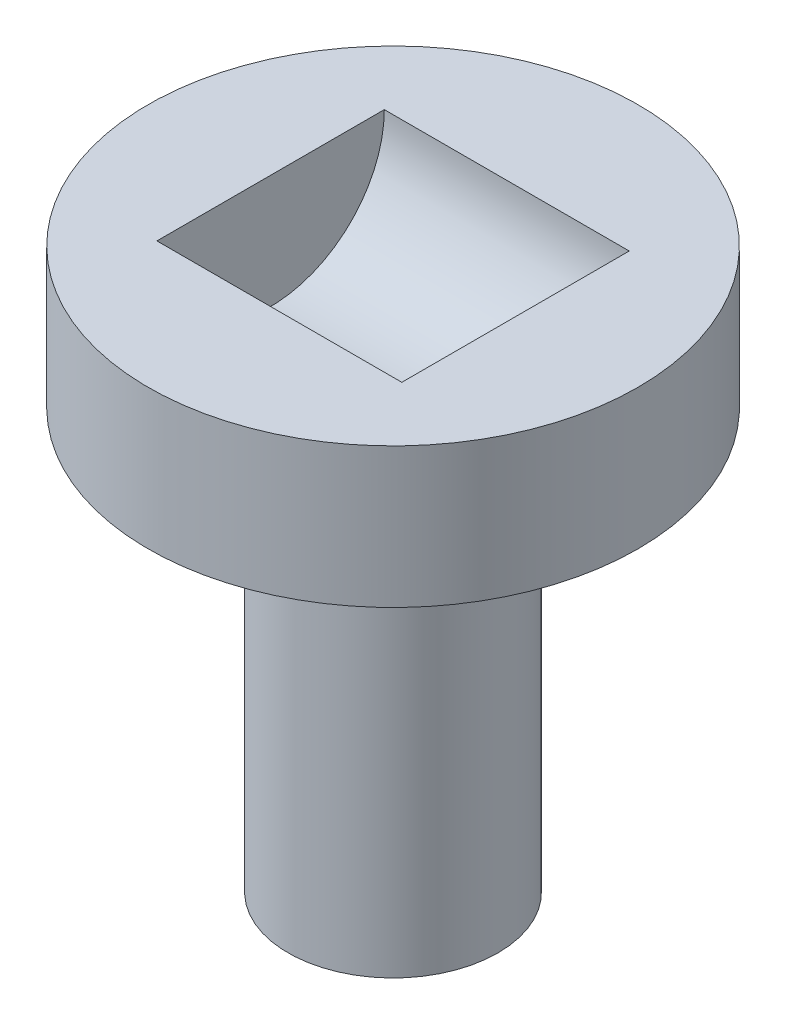
ISO-10303-21;
HEADER;
FILE_DESCRIPTION(('STEP AP214'),'2;1');
FILE_NAME('part.step','',(''),(''),'','','');
FILE_SCHEMA(('AUTOMOTIVE_DESIGN { 1 0 10303 214 1 1 1 1 }'));
ENDSEC;
DATA;
#1=APPLICATION_CONTEXT('core data for automotive mechanical design processes');
#2=APPLICATION_PROTOCOL_DEFINITION('international standard','automotive_design',2000,#1);
#3=PRODUCT_CONTEXT('',#1,'mechanical');
#4=PRODUCT('Part','Part','',(#3));
#5=PRODUCT_RELATED_PRODUCT_CATEGORY('part','',(#4));
#6=PRODUCT_DEFINITION_FORMATION('','',#4);
#7=PRODUCT_DEFINITION_CONTEXT('part definition',#1,'design');
#8=PRODUCT_DEFINITION('design','',#6,#7);
#9=PRODUCT_DEFINITION_SHAPE('','',#8);
#10=(LENGTH_UNIT() NAMED_UNIT(*) SI_UNIT(.MILLI.,.METRE.));
#11=(NAMED_UNIT(*) PLANE_ANGLE_UNIT() SI_UNIT($,.RADIAN.));
#12=(NAMED_UNIT(*) SI_UNIT($,.STERADIAN.) SOLID_ANGLE_UNIT());
#13=UNCERTAINTY_MEASURE_WITH_UNIT(LENGTH_MEASURE(1.E-05),#10,'distance_accuracy_value','');
#14=(GEOMETRIC_REPRESENTATION_CONTEXT(3) GLOBAL_UNCERTAINTY_ASSIGNED_CONTEXT((#13)) GLOBAL_UNIT_ASSIGNED_CONTEXT((#10,
#11,#12)) REPRESENTATION_CONTEXT('',''));
#15=CARTESIAN_POINT('',(0.,0.,0.));
#16=DIRECTION('',(0.,0.,1.));
#17=DIRECTION('',(1.,0.,0.));
#18=AXIS2_PLACEMENT_3D('',#15,#16,#17);
#19=CARTESIAN_POINT('',(0.,7.99999999999999,0.));
#20=DIRECTION('',(0.,1.,0.));
#21=DIRECTION('',(-1.,0.,0.));
#22=AXIS2_PLACEMENT_3D('',#19,#20,#21);
#23=PLANE('',#22);
#24=CARTESIAN_POINT('',(0.,7.99999999999998,0.));
#25=DIRECTION('',(0.,-1.,0.));
#26=DIRECTION('',(1.,0.,0.));
#27=AXIS2_PLACEMENT_3D('',#24,#25,#26);
#28=CIRCLE('',#27,7.00000000000003);
#29=CARTESIAN_POINT('',(7.,8.,0.));
#30=VERTEX_POINT('',#29);
#31=EDGE_CURVE('E91',#30,#30,#28,.T.);
#32=ORIENTED_EDGE('',*,*,#31,.F.);
#33=EDGE_LOOP('',(#32));
#34=FACE_BOUND('',#33,.T.);
#35=DIRECTION('',(1.,0.,0.));
#36=VECTOR('',#35,1.);
#37=CARTESIAN_POINT('',(-3.5,7.99999999999998,3.25));
#38=LINE('',#37,#36);
#39=CARTESIAN_POINT('',(-3.5,7.99999999999998,3.25));
#40=VERTEX_POINT('',#39);
#41=CARTESIAN_POINT('',(3.5,8.,3.25));
#42=VERTEX_POINT('',#41);
#43=EDGE_CURVE('E48',#40,#42,#38,.T.);
#44=ORIENTED_EDGE('',*,*,#43,.F.);
#45=DIRECTION('',(0.,0.,-1.));
#46=VECTOR('',#45,1.);
#47=CARTESIAN_POINT('',(-3.5,7.99999999999998,0.));
#48=LINE('',#47,#46);
#49=CARTESIAN_POINT('',(-3.5,7.99999999999998,-3.25));
#50=VERTEX_POINT('',#49);
#51=EDGE_CURVE('E11',#40,#50,#48,.T.);
#52=ORIENTED_EDGE('',*,*,#51,.T.);
#53=DIRECTION('',(1.,0.,0.));
#54=VECTOR('',#53,1.);
#55=CARTESIAN_POINT('',(-3.5,7.99999999999998,-3.25));
#56=LINE('',#55,#54);
#57=CARTESIAN_POINT('',(3.5,8.,-3.25));
#58=VERTEX_POINT('',#57);
#59=EDGE_CURVE('E72',#58,#50,#56,.F.);
#60=ORIENTED_EDGE('',*,*,#59,.F.);
#61=DIRECTION('',(0.,0.,-1.));
#62=VECTOR('',#61,1.);
#63=CARTESIAN_POINT('',(3.5,8.,0.));
#64=LINE('',#63,#62);
#65=EDGE_CURVE('E66',#42,#58,#64,.T.);
#66=ORIENTED_EDGE('',*,*,#65,.F.);
#67=EDGE_LOOP('',(#44,#52,#60,#66));
#68=FACE_BOUND('',#67,.T.);
#69=ADVANCED_FACE('F39',(#34,#68),#23,.T.);
#70=CARTESIAN_POINT('',(0.,1.99999999999997,0.));
#71=DIRECTION('',(0.,-1.,0.));
#72=DIRECTION('',(1.,0.,0.));
#73=AXIS2_PLACEMENT_3D('',#70,#71,#72);
#74=TOROIDAL_SURFACE('',#73,5.00000000000001,2.);
#75=CARTESIAN_POINT('',(0.,3.99999999999998,0.));
#76=DIRECTION('',(0.,-1.,0.));
#77=DIRECTION('',(1.,0.,0.));
#78=AXIS2_PLACEMENT_3D('',#75,#76,#77);
#79=CIRCLE('',#78,5.00000000000003);
#80=CARTESIAN_POINT('',(5.00000000000001,3.99999999999999,0.));
#81=VERTEX_POINT('',#80);
#82=EDGE_CURVE('E73',#81,#81,#79,.T.);
#83=ORIENTED_EDGE('',*,*,#82,.T.);
#84=EDGE_LOOP('',(#83));
#85=FACE_BOUND('',#84,.T.);
#86=CARTESIAN_POINT('',(0.,1.99999999999997,0.));
#87=DIRECTION('',(0.,-1.,0.));
#88=DIRECTION('',(1.,0.,0.));
#89=AXIS2_PLACEMENT_3D('',#86,#87,#88);
#90=CIRCLE('',#89,3.00000000000001);
#91=CARTESIAN_POINT('',(3.,1.99999999999998,0.));
#92=VERTEX_POINT('',#91);
#93=EDGE_CURVE('E107',#92,#92,#90,.T.);
#94=ORIENTED_EDGE('',*,*,#93,.F.);
#95=EDGE_LOOP('',(#94));
#96=FACE_BOUND('',#95,.T.);
#97=ADVANCED_FACE('F41',(#85,#96),#74,.F.);
#98=CARTESIAN_POINT('',(7.,4.,0.));
#99=DIRECTION('',(0.,-1.,0.));
#100=DIRECTION('',(1.,0.,0.));
#101=AXIS2_PLACEMENT_3D('',#98,#99,#100);
#102=PLANE('',#101);
#103=CARTESIAN_POINT('',(0.,3.99999999999998,0.));
#104=DIRECTION('',(0.,-1.,0.));
#105=DIRECTION('',(1.,0.,0.));
#106=AXIS2_PLACEMENT_3D('',#103,#104,#105);
#107=CIRCLE('',#106,7.00000000000001);
#108=CARTESIAN_POINT('',(7.,4.,0.));
#109=VERTEX_POINT('',#108);
#110=EDGE_CURVE('E87',#109,#109,#107,.T.);
#111=ORIENTED_EDGE('',*,*,#110,.T.);
#112=EDGE_LOOP('',(#111));
#113=FACE_BOUND('',#112,.T.);
#114=ORIENTED_EDGE('',*,*,#82,.F.);
#115=EDGE_LOOP('',(#114));
#116=FACE_BOUND('',#115,.T.);
#117=ADVANCED_FACE('F128',(#113,#116),#102,.T.);
#118=CARTESIAN_POINT('',(5.06163652600005E-13,-147.558866066114,0.));
#119=DIRECTION('',(0.,-1.,0.));
#120=DIRECTION('',(1.,0.,0.));
#121=AXIS2_PLACEMENT_3D('',#118,#119,#120);
#122=CYLINDRICAL_SURFACE('',#121,7.00000000000002);
#123=ORIENTED_EDGE('',*,*,#31,.T.);
#124=EDGE_LOOP('',(#123));
#125=FACE_BOUND('',#124,.T.);
#126=ORIENTED_EDGE('',*,*,#110,.F.);
#127=EDGE_LOOP('',(#126));
#128=FACE_BOUND('',#127,.T.);
#129=ADVANCED_FACE('F135',(#125,#128),#122,.T.);
#130=CARTESIAN_POINT('',(1.22,0.,0.));
#131=DIRECTION('',(0.,-1.,0.));
#132=DIRECTION('',(1.,0.,0.));
#133=AXIS2_PLACEMENT_3D('',#130,#131,#132);
#134=PLANE('',#133);
#135=CARTESIAN_POINT('',(0.,0.,0.));
#136=DIRECTION('',(0.,-1.,0.));
#137=DIRECTION('',(1.,0.,0.));
#138=AXIS2_PLACEMENT_3D('',#135,#136,#137);
#139=CIRCLE('',#138,1.22);
#140=CARTESIAN_POINT('',(1.22,0.,0.));
#141=VERTEX_POINT('',#140);
#142=EDGE_CURVE('E95',#141,#141,#139,.T.);
#143=ORIENTED_EDGE('',*,*,#142,.T.);
#144=EDGE_LOOP('',(#143));
#145=FACE_BOUND('',#144,.T.);
#146=ADVANCED_FACE('F133',(#145),#134,.T.);
#147=CARTESIAN_POINT('',(5.06163652600005E-13,-147.558866066114,0.));
#148=DIRECTION('',(0.,-1.,0.));
#149=DIRECTION('',(1.,0.,0.));
#150=AXIS2_PLACEMENT_3D('',#147,#148,#149);
#151=CYLINDRICAL_SURFACE('',#150,1.21999999999999);
#152=CARTESIAN_POINT('',(0.,-8.00000000000001,0.));
#153=DIRECTION('',(0.,-1.,0.));
#154=DIRECTION('',(1.,0.,0.));
#155=AXIS2_PLACEMENT_3D('',#152,#153,#154);
#156=CIRCLE('',#155,1.21999999999997);
#157=CARTESIAN_POINT('',(1.22,-8.,0.));
#158=VERTEX_POINT('',#157);
#159=EDGE_CURVE('E99',#158,#158,#156,.T.);
#160=ORIENTED_EDGE('',*,*,#159,.T.);
#161=EDGE_LOOP('',(#160));
#162=FACE_BOUND('',#161,.T.);
#163=ORIENTED_EDGE('',*,*,#142,.F.);
#164=EDGE_LOOP('',(#163));
#165=FACE_BOUND('',#164,.T.);
#166=ADVANCED_FACE('F156',(#162,#165),#151,.F.);
#167=CARTESIAN_POINT('',(3.,-8.,0.));
#168=DIRECTION('',(0.,-1.,0.));
#169=DIRECTION('',(1.,0.,0.));
#170=AXIS2_PLACEMENT_3D('',#167,#168,#169);
#171=PLANE('',#170);
#172=CARTESIAN_POINT('',(0.,-8.00000000000001,0.));
#173=DIRECTION('',(0.,-1.,0.));
#174=DIRECTION('',(1.,0.,0.));
#175=AXIS2_PLACEMENT_3D('',#172,#173,#174);
#176=CIRCLE('',#175,2.99999999999997);
#177=CARTESIAN_POINT('',(3.,-8.,0.));
#178=VERTEX_POINT('',#177);
#179=EDGE_CURVE('E103',#178,#178,#176,.T.);
#180=ORIENTED_EDGE('',*,*,#179,.T.);
#181=EDGE_LOOP('',(#180));
#182=FACE_BOUND('',#181,.T.);
#183=ORIENTED_EDGE('',*,*,#159,.F.);
#184=EDGE_LOOP('',(#183));
#185=FACE_BOUND('',#184,.T.);
#186=ADVANCED_FACE('F150',(#182,#185),#171,.T.);
#187=CARTESIAN_POINT('',(5.06163652600005E-13,-147.558866066114,0.));
#188=DIRECTION('',(0.,-1.,0.));
#189=DIRECTION('',(1.,0.,0.));
#190=AXIS2_PLACEMENT_3D('',#187,#188,#189);
#191=CYLINDRICAL_SURFACE('',#190,2.99999999999999);
#192=ORIENTED_EDGE('',*,*,#93,.T.);
#193=EDGE_LOOP('',(#192));
#194=FACE_BOUND('',#193,.T.);
#195=ORIENTED_EDGE('',*,*,#179,.F.);
#196=EDGE_LOOP('',(#195));
#197=FACE_BOUND('',#196,.T.);
#198=ADVANCED_FACE('F120',(#194,#197),#191,.T.);
#199=CARTESIAN_POINT('',(-3.5,7.99999999999998,0.));
#200=DIRECTION('',(1.,0.,0.));
#201=DIRECTION('',(0.,0.,-1.));
#202=AXIS2_PLACEMENT_3D('',#199,#200,#201);
#203=CYLINDRICAL_SURFACE('',#202,3.25);
#204=ORIENTED_EDGE('',*,*,#43,.T.);
#205=CARTESIAN_POINT('',(3.5,7.99999999999998,0.));
#206=DIRECTION('',(1.,0.,0.));
#207=DIRECTION('',(0.,0.,-1.));
#208=AXIS2_PLACEMENT_3D('',#205,#206,#207);
#209=CIRCLE('',#208,3.25);
#210=EDGE_CURVE('E54',#42,#58,#209,.T.);
#211=ORIENTED_EDGE('',*,*,#210,.T.);
#212=ORIENTED_EDGE('',*,*,#59,.T.);
#213=CARTESIAN_POINT('',(-3.5,7.99999999999998,0.));
#214=DIRECTION('',(1.,0.,0.));
#215=DIRECTION('',(0.,0.,-1.));
#216=AXIS2_PLACEMENT_3D('',#213,#214,#215);
#217=CIRCLE('',#216,3.25);
#218=EDGE_CURVE('E78',#40,#50,#217,.T.);
#219=ORIENTED_EDGE('',*,*,#218,.F.);
#220=EDGE_LOOP('',(#204,#211,#212,#219));
#221=FACE_BOUND('',#220,.T.);
#222=ADVANCED_FACE('F76',(#221),#203,.F.);
#223=CARTESIAN_POINT('',(-3.5,7.99999999999998,0.));
#224=DIRECTION('',(1.,0.,0.));
#225=DIRECTION('',(0.,0.,-1.));
#226=AXIS2_PLACEMENT_3D('',#223,#224,#225);
#227=PLANE('',#226);
#228=ORIENTED_EDGE('',*,*,#218,.T.);
#229=ORIENTED_EDGE('',*,*,#51,.F.);
#230=EDGE_LOOP('',(#228,#229));
#231=FACE_BOUND('',#230,.T.);
#232=ADVANCED_FACE('F112',(#231),#227,.T.);
#233=CARTESIAN_POINT('',(3.5,7.99999999999998,0.));
#234=DIRECTION('',(1.,0.,0.));
#235=DIRECTION('',(0.,0.,-1.));
#236=AXIS2_PLACEMENT_3D('',#233,#234,#235);
#237=PLANE('',#236);
#238=ORIENTED_EDGE('',*,*,#65,.T.);
#239=ORIENTED_EDGE('',*,*,#210,.F.);
#240=EDGE_LOOP('',(#238,#239));
#241=FACE_BOUND('',#240,.T.);
#242=ADVANCED_FACE('F67',(#241),#237,.F.);
#243=CLOSED_SHELL('',(#69,#97,#117,#129,#146,#166,#186,#198,#222,#232,#242));
#244=MANIFOLD_SOLID_BREP('B2',#243);
#245=ADVANCED_BREP_SHAPE_REPRESENTATION('',(#18,#244),#14);
#246=SHAPE_DEFINITION_REPRESENTATION(#9,#245);
ENDSEC;
END-ISO-10303-21;
